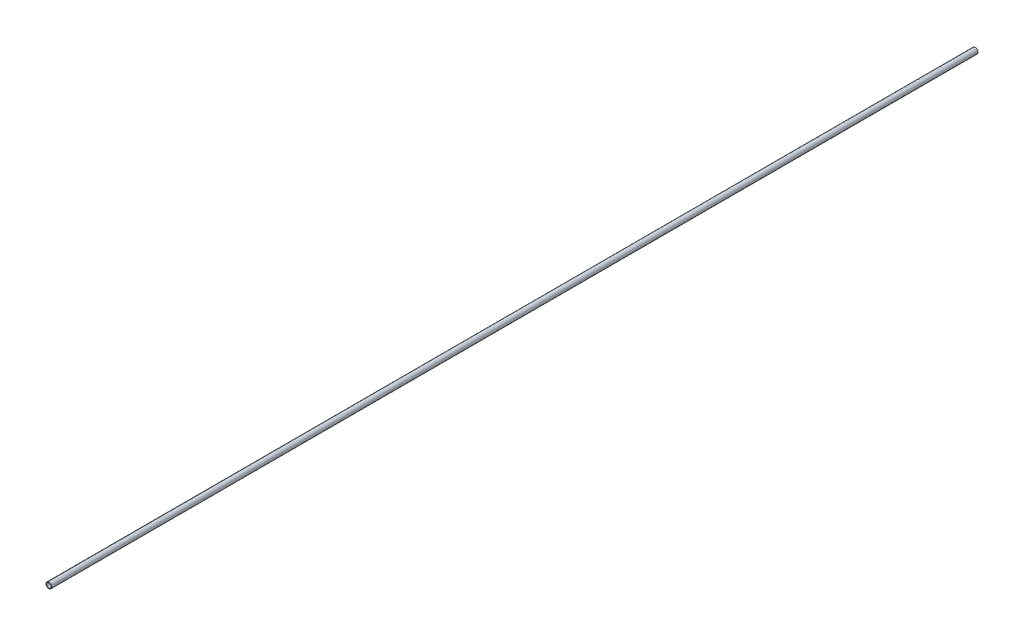
ISO-10303-21;
HEADER;
FILE_DESCRIPTION(('STEP AP214'),'2;1');
FILE_NAME('part.step','',(''),(''),'','','');
FILE_SCHEMA(('AUTOMOTIVE_DESIGN { 1 0 10303 214 1 1 1 1 }'));
ENDSEC;
DATA;
#1=APPLICATION_CONTEXT('core data for automotive mechanical design processes');
#2=APPLICATION_PROTOCOL_DEFINITION('international standard','automotive_design',2000,#1);
#3=PRODUCT_CONTEXT('',#1,'mechanical');
#4=PRODUCT('Part','Part','',(#3));
#5=PRODUCT_RELATED_PRODUCT_CATEGORY('part','',(#4));
#6=PRODUCT_DEFINITION_FORMATION('','',#4);
#7=PRODUCT_DEFINITION_CONTEXT('part definition',#1,'design');
#8=PRODUCT_DEFINITION('design','',#6,#7);
#9=PRODUCT_DEFINITION_SHAPE('','',#8);
#10=(LENGTH_UNIT() NAMED_UNIT(*) SI_UNIT(.MILLI.,.METRE.));
#11=(NAMED_UNIT(*) PLANE_ANGLE_UNIT() SI_UNIT($,.RADIAN.));
#12=(NAMED_UNIT(*) SI_UNIT($,.STERADIAN.) SOLID_ANGLE_UNIT());
#13=UNCERTAINTY_MEASURE_WITH_UNIT(LENGTH_MEASURE(1.E-05),#10,'distance_accuracy_value','');
#14=(GEOMETRIC_REPRESENTATION_CONTEXT(3) GLOBAL_UNCERTAINTY_ASSIGNED_CONTEXT((#13)) GLOBAL_UNIT_ASSIGNED_CONTEXT((#10,
#11,#12)) REPRESENTATION_CONTEXT('',''));
#15=CARTESIAN_POINT('',(0.,0.,0.));
#16=DIRECTION('',(0.,0.,1.));
#17=DIRECTION('',(1.,0.,0.));
#18=AXIS2_PLACEMENT_3D('',#15,#16,#17);
#19=CARTESIAN_POINT('',(0.,0.,5486.4));
#20=DIRECTION('',(0.,0.,1.));
#21=DIRECTION('',(1.,0.,0.));
#22=AXIS2_PLACEMENT_3D('',#19,#20,#21);
#23=PLANE('',#22);
#24=CARTESIAN_POINT('',(0.,0.,5486.4));
#25=DIRECTION('',(0.,0.,1.));
#26=DIRECTION('',(1.,0.,0.));
#27=AXIS2_PLACEMENT_3D('',#24,#25,#26);
#28=CIRCLE('',#27,16.764);
#29=CARTESIAN_POINT('',(16.764,0.,5486.4));
#30=VERTEX_POINT('',#29);
#31=EDGE_CURVE('E10',#30,#30,#28,.T.);
#32=ORIENTED_EDGE('',*,*,#31,.T.);
#33=EDGE_LOOP('',(#32));
#34=FACE_BOUND('',#33,.T.);
#35=CARTESIAN_POINT('',(0.,0.,5486.4));
#36=DIRECTION('',(0.,0.,1.));
#37=DIRECTION('',(1.,0.,0.));
#38=AXIS2_PLACEMENT_3D('',#35,#36,#37);
#39=CIRCLE('',#38,13.3858);
#40=CARTESIAN_POINT('',(13.3858,0.,5486.4));
#41=VERTEX_POINT('',#40);
#42=EDGE_CURVE('E47',#41,#41,#39,.T.);
#43=ORIENTED_EDGE('',*,*,#42,.F.);
#44=EDGE_LOOP('',(#43));
#45=FACE_BOUND('',#44,.T.);
#46=ADVANCED_FACE('F36',(#34,#45),#23,.T.);
#47=CARTESIAN_POINT('',(0.,0.,0.));
#48=DIRECTION('',(0.,0.,1.));
#49=DIRECTION('',(1.,0.,0.));
#50=AXIS2_PLACEMENT_3D('',#47,#48,#49);
#51=PLANE('',#50);
#52=CARTESIAN_POINT('',(0.,0.,0.));
#53=DIRECTION('',(0.,0.,1.));
#54=DIRECTION('',(1.,0.,0.));
#55=AXIS2_PLACEMENT_3D('',#52,#53,#54);
#56=CIRCLE('',#55,16.764);
#57=CARTESIAN_POINT('',(16.764,0.,0.));
#58=VERTEX_POINT('',#57);
#59=EDGE_CURVE('E40',#58,#58,#56,.T.);
#60=ORIENTED_EDGE('',*,*,#59,.F.);
#61=EDGE_LOOP('',(#60));
#62=FACE_BOUND('',#61,.T.);
#63=CARTESIAN_POINT('',(0.,0.,0.));
#64=DIRECTION('',(0.,0.,1.));
#65=DIRECTION('',(1.,0.,0.));
#66=AXIS2_PLACEMENT_3D('',#63,#64,#65);
#67=CIRCLE('',#66,13.3858);
#68=CARTESIAN_POINT('',(13.3858,0.,0.));
#69=VERTEX_POINT('',#68);
#70=EDGE_CURVE('E49',#69,#69,#67,.T.);
#71=ORIENTED_EDGE('',*,*,#70,.T.);
#72=EDGE_LOOP('',(#71));
#73=FACE_BOUND('',#72,.T.);
#74=ADVANCED_FACE('F59',(#62,#73),#51,.F.);
#75=CARTESIAN_POINT('',(0.,0.,5486.4));
#76=DIRECTION('',(0.,0.,-1.));
#77=DIRECTION('',(-1.,0.,0.));
#78=AXIS2_PLACEMENT_3D('',#75,#76,#77);
#79=CYLINDRICAL_SURFACE('',#78,16.764);
#80=ORIENTED_EDGE('',*,*,#31,.F.);
#81=EDGE_LOOP('',(#80));
#82=FACE_BOUND('',#81,.T.);
#83=ORIENTED_EDGE('',*,*,#59,.T.);
#84=EDGE_LOOP('',(#83));
#85=FACE_BOUND('',#84,.T.);
#86=ADVANCED_FACE('F38',(#82,#85),#79,.T.);
#87=CARTESIAN_POINT('',(0.,0.,5486.4));
#88=DIRECTION('',(0.,0.,-1.));
#89=DIRECTION('',(-1.,0.,0.));
#90=AXIS2_PLACEMENT_3D('',#87,#88,#89);
#91=CYLINDRICAL_SURFACE('',#90,13.3858);
#92=ORIENTED_EDGE('',*,*,#42,.T.);
#93=EDGE_LOOP('',(#92));
#94=FACE_BOUND('',#93,.T.);
#95=ORIENTED_EDGE('',*,*,#70,.F.);
#96=EDGE_LOOP('',(#95));
#97=FACE_BOUND('',#96,.T.);
#98=ADVANCED_FACE('F55',(#94,#97),#91,.F.);
#99=CLOSED_SHELL('',(#46,#74,#86,#98));
#100=MANIFOLD_SOLID_BREP('B2',#99);
#101=ADVANCED_BREP_SHAPE_REPRESENTATION('',(#18,#100),#14);
#102=SHAPE_DEFINITION_REPRESENTATION(#9,#101);
ENDSEC;
END-ISO-10303-21;
